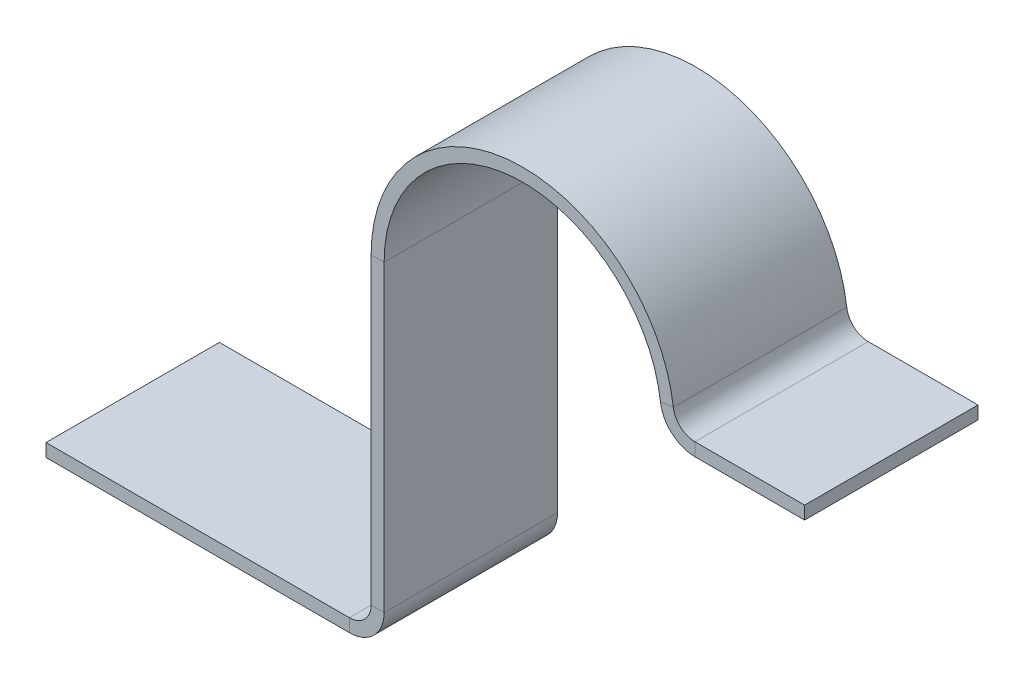
ISO-10303-21;
HEADER;
FILE_DESCRIPTION(('STEP AP214'),'2;1');
FILE_NAME('part.step','',(''),(''),'','','');
FILE_SCHEMA(('AUTOMOTIVE_DESIGN { 1 0 10303 214 1 1 1 1 }'));
ENDSEC;
DATA;
#1=APPLICATION_CONTEXT('core data for automotive mechanical design processes');
#2=APPLICATION_PROTOCOL_DEFINITION('international standard','automotive_design',2000,#1);
#3=PRODUCT_CONTEXT('',#1,'mechanical');
#4=PRODUCT('Part','Part','',(#3));
#5=PRODUCT_RELATED_PRODUCT_CATEGORY('part','',(#4));
#6=PRODUCT_DEFINITION_FORMATION('','',#4);
#7=PRODUCT_DEFINITION_CONTEXT('part definition',#1,'design');
#8=PRODUCT_DEFINITION('design','',#6,#7);
#9=PRODUCT_DEFINITION_SHAPE('','',#8);
#10=(LENGTH_UNIT() NAMED_UNIT(*) SI_UNIT(.MILLI.,.METRE.));
#11=(NAMED_UNIT(*) PLANE_ANGLE_UNIT() SI_UNIT($,.RADIAN.));
#12=(NAMED_UNIT(*) SI_UNIT($,.STERADIAN.) SOLID_ANGLE_UNIT());
#13=UNCERTAINTY_MEASURE_WITH_UNIT(LENGTH_MEASURE(1.E-05),#10,'distance_accuracy_value','');
#14=(GEOMETRIC_REPRESENTATION_CONTEXT(3) GLOBAL_UNCERTAINTY_ASSIGNED_CONTEXT((#13)) GLOBAL_UNIT_ASSIGNED_CONTEXT((#10,
#11,#12)) REPRESENTATION_CONTEXT('',''));
#15=CARTESIAN_POINT('',(0.,0.,0.));
#16=DIRECTION('',(0.,0.,1.));
#17=DIRECTION('',(1.,0.,0.));
#18=AXIS2_PLACEMENT_3D('',#15,#16,#17);
#19=CARTESIAN_POINT('',(3.,75.,40.));
#20=DIRECTION('',(0.,0.,1.));
#21=DIRECTION('',(1.,0.,0.));
#22=AXIS2_PLACEMENT_3D('',#19,#20,#21);
#23=PLANE('',#22);
#24=DIRECTION('',(-1.,0.,0.));
#25=VECTOR('',#24,1.);
#26=CARTESIAN_POINT('',(3.,75.,40.));
#27=LINE('',#26,#25);
#28=CARTESIAN_POINT('',(3.,75.,40.));
#29=VERTEX_POINT('',#28);
#30=CARTESIAN_POINT('',(0.,75.,40.));
#31=VERTEX_POINT('',#30);
#32=EDGE_CURVE('E11',#29,#31,#27,.T.);
#33=ORIENTED_EDGE('',*,*,#32,.F.);
#34=CARTESIAN_POINT('',(35.,75.,40.));
#35=DIRECTION('',(0.,0.,1.));
#36=DIRECTION('',(1.,0.,0.));
#37=AXIS2_PLACEMENT_3D('',#34,#35,#36);
#38=CIRCLE('',#37,32.);
#39=CARTESIAN_POINT('',(66.7490157327751,79.,40.));
#40=VERTEX_POINT('',#39);
#41=EDGE_CURVE('E149',#29,#40,#38,.F.);
#42=ORIENTED_EDGE('',*,*,#41,.T.);
#43=DIRECTION('',(0.992156741649222,0.124999999999999,0.));
#44=VECTOR('',#43,1.);
#45=CARTESIAN_POINT('',(66.7490157327751,79.,40.));
#46=LINE('',#45,#44);
#47=CARTESIAN_POINT('',(69.7254859577228,79.375,40.));
#48=VERTEX_POINT('',#47);
#49=EDGE_CURVE('E254',#40,#48,#46,.T.);
#50=ORIENTED_EDGE('',*,*,#49,.T.);
#51=CARTESIAN_POINT('',(35.,75.,40.));
#52=DIRECTION('',(0.,0.,-1.));
#53=DIRECTION('',(-1.,0.,0.));
#54=AXIS2_PLACEMENT_3D('',#51,#52,#53);
#55=CIRCLE('',#54,35.);
#56=EDGE_CURVE('E152',#31,#48,#55,.T.);
#57=ORIENTED_EDGE('',*,*,#56,.F.);
#58=EDGE_LOOP('',(#33,#42,#50,#57));
#59=FACE_BOUND('',#58,.T.);
#60=ADVANCED_FACE('F38',(#59),#23,.T.);
#61=CARTESIAN_POINT('',(0.,75.,0.));
#62=DIRECTION('',(0.,0.,-1.));
#63=DIRECTION('',(-1.,0.,0.));
#64=AXIS2_PLACEMENT_3D('',#61,#62,#63);
#65=PLANE('',#64);
#66=DIRECTION('',(1.,0.,0.));
#67=VECTOR('',#66,1.);
#68=CARTESIAN_POINT('',(0.,75.,0.));
#69=LINE('',#68,#67);
#70=CARTESIAN_POINT('',(0.,75.,0.));
#71=VERTEX_POINT('',#70);
#72=CARTESIAN_POINT('',(3.,75.,0.));
#73=VERTEX_POINT('',#72);
#74=EDGE_CURVE('E46',#71,#73,#69,.T.);
#75=ORIENTED_EDGE('',*,*,#74,.F.);
#76=CARTESIAN_POINT('',(35.,75.,0.));
#77=DIRECTION('',(0.,0.,-1.));
#78=DIRECTION('',(-1.,0.,0.));
#79=AXIS2_PLACEMENT_3D('',#76,#77,#78);
#80=CIRCLE('',#79,35.);
#81=CARTESIAN_POINT('',(69.7254859577228,79.375,0.));
#82=VERTEX_POINT('',#81);
#83=EDGE_CURVE('E197',#71,#82,#80,.T.);
#84=ORIENTED_EDGE('',*,*,#83,.T.);
#85=DIRECTION('',(-0.992156741649222,-0.124999999999999,0.));
#86=VECTOR('',#85,1.);
#87=CARTESIAN_POINT('',(69.7254859577228,79.375,0.));
#88=LINE('',#87,#86);
#89=CARTESIAN_POINT('',(66.7490157327751,79.,0.));
#90=VERTEX_POINT('',#89);
#91=EDGE_CURVE('E101',#82,#90,#88,.T.);
#92=ORIENTED_EDGE('',*,*,#91,.T.);
#93=CARTESIAN_POINT('',(35.,75.,0.));
#94=DIRECTION('',(0.,0.,1.));
#95=DIRECTION('',(1.,0.,0.));
#96=AXIS2_PLACEMENT_3D('',#93,#94,#95);
#97=CIRCLE('',#96,32.);
#98=EDGE_CURVE('E218',#73,#90,#97,.F.);
#99=ORIENTED_EDGE('',*,*,#98,.F.);
#100=EDGE_LOOP('',(#75,#84,#92,#99));
#101=FACE_BOUND('',#100,.T.);
#102=ADVANCED_FACE('F266',(#101),#65,.T.);
#103=CARTESIAN_POINT('',(0.,5.,40.));
#104=DIRECTION('',(0.,0.,1.));
#105=DIRECTION('',(1.,0.,0.));
#106=AXIS2_PLACEMENT_3D('',#103,#104,#105);
#107=PLANE('',#106);
#108=DIRECTION('',(1.,0.,0.));
#109=VECTOR('',#108,1.);
#110=CARTESIAN_POINT('',(0.,5.,40.));
#111=LINE('',#110,#109);
#112=CARTESIAN_POINT('',(0.,5.,40.));
#113=VERTEX_POINT('',#112);
#114=CARTESIAN_POINT('',(3.,5.,40.));
#115=VERTEX_POINT('',#114);
#116=EDGE_CURVE('E161',#113,#115,#111,.T.);
#117=ORIENTED_EDGE('',*,*,#116,.F.);
#118=CARTESIAN_POINT('',(-5.,5.,40.));
#119=DIRECTION('',(0.,0.,-1.));
#120=DIRECTION('',(-1.,0.,0.));
#121=AXIS2_PLACEMENT_3D('',#118,#119,#120);
#122=CIRCLE('',#121,5.);
#123=CARTESIAN_POINT('',(-5.,0.,40.));
#124=VERTEX_POINT('',#123);
#125=EDGE_CURVE('E306',#124,#113,#122,.F.);
#126=ORIENTED_EDGE('',*,*,#125,.F.);
#127=DIRECTION('',(0.,1.,0.));
#128=VECTOR('',#127,1.);
#129=CARTESIAN_POINT('',(-5.,-3.,40.));
#130=LINE('',#129,#128);
#131=CARTESIAN_POINT('',(-5.,-3.,40.));
#132=VERTEX_POINT('',#131);
#133=EDGE_CURVE('E261',#132,#124,#130,.T.);
#134=ORIENTED_EDGE('',*,*,#133,.F.);
#135=CARTESIAN_POINT('',(-5.,5.,40.));
#136=DIRECTION('',(0.,0.,1.));
#137=DIRECTION('',(1.,0.,0.));
#138=AXIS2_PLACEMENT_3D('',#135,#136,#137);
#139=CIRCLE('',#138,8.);
#140=EDGE_CURVE('E165',#132,#115,#139,.T.);
#141=ORIENTED_EDGE('',*,*,#140,.T.);
#142=EDGE_LOOP('',(#117,#126,#134,#141));
#143=FACE_BOUND('',#142,.T.);
#144=ADVANCED_FACE('F320',(#143),#107,.T.);
#145=CARTESIAN_POINT('',(-5.,-3.,40.));
#146=DIRECTION('',(0.,0.,1.));
#147=DIRECTION('',(1.,0.,0.));
#148=AXIS2_PLACEMENT_3D('',#145,#146,#147);
#149=PLANE('',#148);
#150=DIRECTION('',(0.,1.,0.));
#151=VECTOR('',#150,1.);
#152=CARTESIAN_POINT('',(0.,0.,40.));
#153=LINE('',#152,#151);
#154=EDGE_CURVE('E271',#113,#31,#153,.T.);
#155=ORIENTED_EDGE('',*,*,#154,.F.);
#156=ORIENTED_EDGE('',*,*,#116,.T.);
#157=DIRECTION('',(0.,1.,0.));
#158=VECTOR('',#157,1.);
#159=CARTESIAN_POINT('',(3.,0.,40.));
#160=LINE('',#159,#158);
#161=EDGE_CURVE('E158',#115,#29,#160,.T.);
#162=ORIENTED_EDGE('',*,*,#161,.T.);
#163=ORIENTED_EDGE('',*,*,#32,.T.);
#164=EDGE_LOOP('',(#155,#156,#162,#163));
#165=FACE_BOUND('',#164,.T.);
#166=ADVANCED_FACE('F160',(#165),#149,.T.);
#167=CARTESIAN_POINT('',(-5.,0.,0.));
#168=DIRECTION('',(0.,0.,-1.));
#169=DIRECTION('',(-1.,0.,0.));
#170=AXIS2_PLACEMENT_3D('',#167,#168,#169);
#171=PLANE('',#170);
#172=DIRECTION('',(0.,-1.,0.));
#173=VECTOR('',#172,1.);
#174=CARTESIAN_POINT('',(-5.,0.,0.));
#175=LINE('',#174,#173);
#176=CARTESIAN_POINT('',(-5.,0.,0.));
#177=VERTEX_POINT('',#176);
#178=CARTESIAN_POINT('',(-5.,-3.,0.));
#179=VERTEX_POINT('',#178);
#180=EDGE_CURVE('E259',#177,#179,#175,.T.);
#181=ORIENTED_EDGE('',*,*,#180,.F.);
#182=CARTESIAN_POINT('',(-5.,5.,0.));
#183=DIRECTION('',(0.,0.,-1.));
#184=DIRECTION('',(-1.,0.,0.));
#185=AXIS2_PLACEMENT_3D('',#182,#183,#184);
#186=CIRCLE('',#185,5.);
#187=CARTESIAN_POINT('',(0.,5.,0.));
#188=VERTEX_POINT('',#187);
#189=EDGE_CURVE('E202',#177,#188,#186,.F.);
#190=ORIENTED_EDGE('',*,*,#189,.T.);
#191=DIRECTION('',(-1.,0.,0.));
#192=VECTOR('',#191,1.);
#193=CARTESIAN_POINT('',(3.,5.,0.));
#194=LINE('',#193,#192);
#195=CARTESIAN_POINT('',(3.,5.,0.));
#196=VERTEX_POINT('',#195);
#197=EDGE_CURVE('E257',#196,#188,#194,.T.);
#198=ORIENTED_EDGE('',*,*,#197,.F.);
#199=CARTESIAN_POINT('',(-5.,5.,0.));
#200=DIRECTION('',(0.,0.,1.));
#201=DIRECTION('',(1.,0.,0.));
#202=AXIS2_PLACEMENT_3D('',#199,#200,#201);
#203=CIRCLE('',#202,8.);
#204=EDGE_CURVE('E214',#179,#196,#203,.T.);
#205=ORIENTED_EDGE('',*,*,#204,.F.);
#206=EDGE_LOOP('',(#181,#190,#198,#205));
#207=FACE_BOUND('',#206,.T.);
#208=ADVANCED_FACE('F327',(#207),#171,.T.);
#209=CARTESIAN_POINT('',(3.,5.,0.));
#210=DIRECTION('',(0.,0.,-1.));
#211=DIRECTION('',(-1.,0.,0.));
#212=AXIS2_PLACEMENT_3D('',#209,#210,#211);
#213=PLANE('',#212);
#214=DIRECTION('',(1.,0.,0.));
#215=VECTOR('',#214,1.);
#216=CARTESIAN_POINT('',(-75.,0.,0.));
#217=LINE('',#216,#215);
#218=CARTESIAN_POINT('',(-75.,0.,0.));
#219=VERTEX_POINT('',#218);
#220=EDGE_CURVE('E205',#219,#177,#217,.T.);
#221=ORIENTED_EDGE('',*,*,#220,.T.);
#222=ORIENTED_EDGE('',*,*,#180,.T.);
#223=DIRECTION('',(1.,0.,0.));
#224=VECTOR('',#223,1.);
#225=CARTESIAN_POINT('',(-75.,-3.,0.));
#226=LINE('',#225,#224);
#227=CARTESIAN_POINT('',(-75.,-3.,0.));
#228=VERTEX_POINT('',#227);
#229=EDGE_CURVE('E211',#228,#179,#226,.T.);
#230=ORIENTED_EDGE('',*,*,#229,.F.);
#231=DIRECTION('',(0.,1.,0.));
#232=VECTOR('',#231,1.);
#233=CARTESIAN_POINT('',(-75.,-3.,0.));
#234=LINE('',#233,#232);
#235=EDGE_CURVE('E208',#228,#219,#234,.T.);
#236=ORIENTED_EDGE('',*,*,#235,.T.);
#237=EDGE_LOOP('',(#221,#222,#230,#236));
#238=FACE_BOUND('',#237,.T.);
#239=ADVANCED_FACE('F347',(#238),#213,.T.);
#240=CARTESIAN_POINT('',(74.6862696659689,75.,40.));
#241=DIRECTION('',(0.,0.,1.));
#242=DIRECTION('',(1.,0.,0.));
#243=AXIS2_PLACEMENT_3D('',#240,#241,#242);
#244=PLANE('',#243);
#245=DIRECTION('',(0.,-1.,0.));
#246=VECTOR('',#245,1.);
#247=CARTESIAN_POINT('',(74.6862696659689,75.,40.));
#248=LINE('',#247,#246);
#249=CARTESIAN_POINT('',(74.6862696659689,75.,40.));
#250=VERTEX_POINT('',#249);
#251=CARTESIAN_POINT('',(74.6862696659689,72.,40.));
#252=VERTEX_POINT('',#251);
#253=EDGE_CURVE('E54',#250,#252,#248,.T.);
#254=ORIENTED_EDGE('',*,*,#253,.F.);
#255=CARTESIAN_POINT('',(74.6862696659689,80.,40.));
#256=DIRECTION('',(0.,0.,-1.));
#257=DIRECTION('',(-1.,0.,0.));
#258=AXIS2_PLACEMENT_3D('',#255,#256,#257);
#259=CIRCLE('',#258,5.);
#260=EDGE_CURVE('E299',#48,#250,#259,.F.);
#261=ORIENTED_EDGE('',*,*,#260,.F.);
#262=ORIENTED_EDGE('',*,*,#49,.F.);
#263=CARTESIAN_POINT('',(74.6862696659689,80.,40.));
#264=DIRECTION('',(0.,0.,1.));
#265=DIRECTION('',(1.,0.,0.));
#266=AXIS2_PLACEMENT_3D('',#263,#264,#265);
#267=CIRCLE('',#266,8.);
#268=EDGE_CURVE('E180',#40,#252,#267,.T.);
#269=ORIENTED_EDGE('',*,*,#268,.T.);
#270=EDGE_LOOP('',(#254,#261,#262,#269));
#271=FACE_BOUND('',#270,.T.);
#272=ADVANCED_FACE('F349',(#271),#244,.T.);
#273=CARTESIAN_POINT('',(66.7490157327751,79.,40.));
#274=DIRECTION('',(0.,0.,1.));
#275=DIRECTION('',(1.,0.,0.));
#276=AXIS2_PLACEMENT_3D('',#273,#274,#275);
#277=PLANE('',#276);
#278=DIRECTION('',(1.,0.,0.));
#279=VECTOR('',#278,1.);
#280=CARTESIAN_POINT('',(70.,75.,40.));
#281=LINE('',#280,#279);
#282=CARTESIAN_POINT('',(100.,75.,40.));
#283=VERTEX_POINT('',#282);
#284=EDGE_CURVE('E297',#250,#283,#281,.T.);
#285=ORIENTED_EDGE('',*,*,#284,.F.);
#286=ORIENTED_EDGE('',*,*,#253,.T.);
#287=DIRECTION('',(1.,0.,0.));
#288=VECTOR('',#287,1.);
#289=CARTESIAN_POINT('',(70.,72.,40.));
#290=LINE('',#289,#288);
#291=CARTESIAN_POINT('',(100.,72.,40.));
#292=VERTEX_POINT('',#291);
#293=EDGE_CURVE('E114',#252,#292,#290,.T.);
#294=ORIENTED_EDGE('',*,*,#293,.T.);
#295=DIRECTION('',(0.,-1.,0.));
#296=VECTOR('',#295,1.);
#297=CARTESIAN_POINT('',(100.,75.,40.));
#298=LINE('',#297,#296);
#299=EDGE_CURVE('E295',#283,#292,#298,.T.);
#300=ORIENTED_EDGE('',*,*,#299,.F.);
#301=EDGE_LOOP('',(#285,#286,#294,#300));
#302=FACE_BOUND('',#301,.T.);
#303=ADVANCED_FACE('F355',(#302),#277,.T.);
#304=CARTESIAN_POINT('',(69.7254859577228,79.375,0.));
#305=DIRECTION('',(0.,0.,-1.));
#306=DIRECTION('',(-1.,0.,0.));
#307=AXIS2_PLACEMENT_3D('',#304,#305,#306);
#308=PLANE('',#307);
#309=ORIENTED_EDGE('',*,*,#91,.F.);
#310=CARTESIAN_POINT('',(74.6862696659689,80.,0.));
#311=DIRECTION('',(0.,0.,-1.));
#312=DIRECTION('',(-1.,0.,0.));
#313=AXIS2_PLACEMENT_3D('',#310,#311,#312);
#314=CIRCLE('',#313,5.);
#315=CARTESIAN_POINT('',(74.6862696659689,75.,0.));
#316=VERTEX_POINT('',#315);
#317=EDGE_CURVE('E195',#82,#316,#314,.F.);
#318=ORIENTED_EDGE('',*,*,#317,.T.);
#319=DIRECTION('',(0.,1.,0.));
#320=VECTOR('',#319,1.);
#321=CARTESIAN_POINT('',(74.6862696659689,72.,0.));
#322=LINE('',#321,#320);
#323=CARTESIAN_POINT('',(74.6862696659689,72.,0.));
#324=VERTEX_POINT('',#323);
#325=EDGE_CURVE('E108',#324,#316,#322,.T.);
#326=ORIENTED_EDGE('',*,*,#325,.F.);
#327=CARTESIAN_POINT('',(74.6862696659689,80.,0.));
#328=DIRECTION('',(0.,0.,1.));
#329=DIRECTION('',(1.,0.,0.));
#330=AXIS2_PLACEMENT_3D('',#327,#328,#329);
#331=CIRCLE('',#330,8.);
#332=EDGE_CURVE('E220',#90,#324,#331,.T.);
#333=ORIENTED_EDGE('',*,*,#332,.F.);
#334=EDGE_LOOP('',(#309,#318,#326,#333));
#335=FACE_BOUND('',#334,.T.);
#336=ADVANCED_FACE('F282',(#335),#308,.T.);
#337=CARTESIAN_POINT('',(74.6862696659689,72.,0.));
#338=DIRECTION('',(0.,0.,-1.));
#339=DIRECTION('',(-1.,0.,0.));
#340=AXIS2_PLACEMENT_3D('',#337,#338,#339);
#341=PLANE('',#340);
#342=DIRECTION('',(0.,1.,0.));
#343=VECTOR('',#342,1.);
#344=CARTESIAN_POINT('',(0.,0.,0.));
#345=LINE('',#344,#343);
#346=EDGE_CURVE('E199',#188,#71,#345,.T.);
#347=ORIENTED_EDGE('',*,*,#346,.T.);
#348=ORIENTED_EDGE('',*,*,#74,.T.);
#349=DIRECTION('',(0.,1.,0.));
#350=VECTOR('',#349,1.);
#351=CARTESIAN_POINT('',(3.,0.,0.));
#352=LINE('',#351,#350);
#353=EDGE_CURVE('E172',#196,#73,#352,.T.);
#354=ORIENTED_EDGE('',*,*,#353,.F.);
#355=ORIENTED_EDGE('',*,*,#197,.T.);
#356=EDGE_LOOP('',(#347,#348,#354,#355));
#357=FACE_BOUND('',#356,.T.);
#358=ADVANCED_FACE('F264',(#357),#341,.T.);
#359=CARTESIAN_POINT('',(70.,72.,40.));
#360=DIRECTION('',(0.,1.,0.));
#361=DIRECTION('',(0.,0.,1.));
#362=AXIS2_PLACEMENT_3D('',#359,#360,#361);
#363=PLANE('',#362);
#364=DIRECTION('',(1.,0.,0.));
#365=VECTOR('',#364,1.);
#366=CARTESIAN_POINT('',(70.,72.,0.));
#367=LINE('',#366,#365);
#368=CARTESIAN_POINT('',(100.,72.,0.));
#369=VERTEX_POINT('',#368);
#370=EDGE_CURVE('E186',#324,#369,#367,.T.);
#371=ORIENTED_EDGE('',*,*,#370,.T.);
#372=DIRECTION('',(0.,0.,-1.));
#373=VECTOR('',#372,1.);
#374=CARTESIAN_POINT('',(100.,72.,40.));
#375=LINE('',#374,#373);
#376=EDGE_CURVE('E250',#292,#369,#375,.T.);
#377=ORIENTED_EDGE('',*,*,#376,.F.);
#378=ORIENTED_EDGE('',*,*,#293,.F.);
#379=DIRECTION('',(0.,0.,-1.));
#380=VECTOR('',#379,1.);
#381=CARTESIAN_POINT('',(74.6862696659689,72.,40.));
#382=LINE('',#381,#380);
#383=EDGE_CURVE('E182',#252,#324,#382,.T.);
#384=ORIENTED_EDGE('',*,*,#383,.T.);
#385=EDGE_LOOP('',(#371,#377,#378,#384));
#386=FACE_BOUND('',#385,.T.);
#387=ADVANCED_FACE('F288',(#386),#363,.F.);
#388=CARTESIAN_POINT('',(100.,75.,40.));
#389=DIRECTION('',(1.,0.,0.));
#390=DIRECTION('',(0.,0.,-1.));
#391=AXIS2_PLACEMENT_3D('',#388,#389,#390);
#392=PLANE('',#391);
#393=DIRECTION('',(0.,-1.,0.));
#394=VECTOR('',#393,1.);
#395=CARTESIAN_POINT('',(100.,75.,0.));
#396=LINE('',#395,#394);
#397=CARTESIAN_POINT('',(100.,75.,0.));
#398=VERTEX_POINT('',#397);
#399=EDGE_CURVE('E189',#398,#369,#396,.T.);
#400=ORIENTED_EDGE('',*,*,#399,.F.);
#401=DIRECTION('',(0.,0.,-1.));
#402=VECTOR('',#401,1.);
#403=CARTESIAN_POINT('',(100.,75.,40.));
#404=LINE('',#403,#402);
#405=EDGE_CURVE('E248',#283,#398,#404,.T.);
#406=ORIENTED_EDGE('',*,*,#405,.F.);
#407=ORIENTED_EDGE('',*,*,#299,.T.);
#408=ORIENTED_EDGE('',*,*,#376,.T.);
#409=EDGE_LOOP('',(#400,#406,#407,#408));
#410=FACE_BOUND('',#409,.T.);
#411=ADVANCED_FACE('F293',(#410),#392,.T.);
#412=CARTESIAN_POINT('',(70.,75.,40.));
#413=DIRECTION('',(0.,1.,0.));
#414=DIRECTION('',(0.,0.,1.));
#415=AXIS2_PLACEMENT_3D('',#412,#413,#414);
#416=PLANE('',#415);
#417=DIRECTION('',(1.,0.,0.));
#418=VECTOR('',#417,1.);
#419=CARTESIAN_POINT('',(70.,75.,0.));
#420=LINE('',#419,#418);
#421=EDGE_CURVE('E192',#316,#398,#420,.T.);
#422=ORIENTED_EDGE('',*,*,#421,.F.);
#423=DIRECTION('',(0.,0.,-1.));
#424=VECTOR('',#423,1.);
#425=CARTESIAN_POINT('',(74.6862696659689,75.,40.));
#426=LINE('',#425,#424);
#427=EDGE_CURVE('E245',#250,#316,#426,.T.);
#428=ORIENTED_EDGE('',*,*,#427,.F.);
#429=ORIENTED_EDGE('',*,*,#284,.T.);
#430=ORIENTED_EDGE('',*,*,#405,.T.);
#431=EDGE_LOOP('',(#422,#428,#429,#430));
#432=FACE_BOUND('',#431,.T.);
#433=ADVANCED_FACE('F435',(#432),#416,.T.);
#434=CARTESIAN_POINT('',(74.6862696659689,80.,40.));
#435=DIRECTION('',(0.,0.,-1.));
#436=DIRECTION('',(-1.,0.,0.));
#437=AXIS2_PLACEMENT_3D('',#434,#435,#436);
#438=CYLINDRICAL_SURFACE('',#437,5.);
#439=ORIENTED_EDGE('',*,*,#317,.F.);
#440=DIRECTION('',(0.,0.,-1.));
#441=VECTOR('',#440,1.);
#442=CARTESIAN_POINT('',(69.7254859577228,79.375,40.));
#443=LINE('',#442,#441);
#444=EDGE_CURVE('E242',#48,#82,#443,.T.);
#445=ORIENTED_EDGE('',*,*,#444,.F.);
#446=ORIENTED_EDGE('',*,*,#260,.T.);
#447=ORIENTED_EDGE('',*,*,#427,.T.);
#448=EDGE_LOOP('',(#439,#445,#446,#447));
#449=FACE_BOUND('',#448,.T.);
#450=ADVANCED_FACE('F279',(#449),#438,.F.);
#451=CARTESIAN_POINT('',(35.,75.,40.));
#452=DIRECTION('',(0.,0.,-1.));
#453=DIRECTION('',(-1.,0.,0.));
#454=AXIS2_PLACEMENT_3D('',#451,#452,#453);
#455=CYLINDRICAL_SURFACE('',#454,35.);
#456=ORIENTED_EDGE('',*,*,#83,.F.);
#457=DIRECTION('',(0.,0.,-1.));
#458=VECTOR('',#457,1.);
#459=CARTESIAN_POINT('',(0.,75.,40.));
#460=LINE('',#459,#458);
#461=EDGE_CURVE('E239',#31,#71,#460,.T.);
#462=ORIENTED_EDGE('',*,*,#461,.F.);
#463=ORIENTED_EDGE('',*,*,#56,.T.);
#464=ORIENTED_EDGE('',*,*,#444,.T.);
#465=EDGE_LOOP('',(#456,#462,#463,#464));
#466=FACE_BOUND('',#465,.T.);
#467=ADVANCED_FACE('F273',(#466),#455,.T.);
#468=CARTESIAN_POINT('',(0.,0.,40.));
#469=DIRECTION('',(-1.,0.,0.));
#470=DIRECTION('',(0.,0.,1.));
#471=AXIS2_PLACEMENT_3D('',#468,#469,#470);
#472=PLANE('',#471);
#473=ORIENTED_EDGE('',*,*,#346,.F.);
#474=DIRECTION('',(0.,0.,-1.));
#475=VECTOR('',#474,1.);
#476=CARTESIAN_POINT('',(0.,5.,40.));
#477=LINE('',#476,#475);
#478=EDGE_CURVE('E236',#113,#188,#477,.T.);
#479=ORIENTED_EDGE('',*,*,#478,.F.);
#480=ORIENTED_EDGE('',*,*,#154,.T.);
#481=ORIENTED_EDGE('',*,*,#461,.T.);
#482=EDGE_LOOP('',(#473,#479,#480,#481));
#483=FACE_BOUND('',#482,.T.);
#484=ADVANCED_FACE('F269',(#483),#472,.T.);
#485=CARTESIAN_POINT('',(-5.,5.,40.));
#486=DIRECTION('',(0.,0.,-1.));
#487=DIRECTION('',(-1.,0.,0.));
#488=AXIS2_PLACEMENT_3D('',#485,#486,#487);
#489=CYLINDRICAL_SURFACE('',#488,5.);
#490=ORIENTED_EDGE('',*,*,#189,.F.);
#491=DIRECTION('',(0.,0.,-1.));
#492=VECTOR('',#491,1.);
#493=CARTESIAN_POINT('',(-5.,0.,40.));
#494=LINE('',#493,#492);
#495=EDGE_CURVE('E233',#124,#177,#494,.T.);
#496=ORIENTED_EDGE('',*,*,#495,.F.);
#497=ORIENTED_EDGE('',*,*,#125,.T.);
#498=ORIENTED_EDGE('',*,*,#478,.T.);
#499=EDGE_LOOP('',(#490,#496,#497,#498));
#500=FACE_BOUND('',#499,.T.);
#501=ADVANCED_FACE('F330',(#500),#489,.F.);
#502=CARTESIAN_POINT('',(-75.,0.,40.));
#503=DIRECTION('',(0.,1.,0.));
#504=DIRECTION('',(0.,0.,1.));
#505=AXIS2_PLACEMENT_3D('',#502,#503,#504);
#506=PLANE('',#505);
#507=ORIENTED_EDGE('',*,*,#220,.F.);
#508=DIRECTION('',(0.,0.,-1.));
#509=VECTOR('',#508,1.);
#510=CARTESIAN_POINT('',(-75.,0.,40.));
#511=LINE('',#510,#509);
#512=CARTESIAN_POINT('',(-75.,0.,40.));
#513=VERTEX_POINT('',#512);
#514=EDGE_CURVE('E231',#513,#219,#511,.T.);
#515=ORIENTED_EDGE('',*,*,#514,.F.);
#516=DIRECTION('',(1.,0.,0.));
#517=VECTOR('',#516,1.);
#518=CARTESIAN_POINT('',(-75.,0.,40.));
#519=LINE('',#518,#517);
#520=EDGE_CURVE('E309',#513,#124,#519,.T.);
#521=ORIENTED_EDGE('',*,*,#520,.T.);
#522=ORIENTED_EDGE('',*,*,#495,.T.);
#523=EDGE_LOOP('',(#507,#515,#521,#522));
#524=FACE_BOUND('',#523,.T.);
#525=ADVANCED_FACE('F335',(#524),#506,.T.);
#526=CARTESIAN_POINT('',(-75.,-3.,40.));
#527=DIRECTION('',(-1.,0.,0.));
#528=DIRECTION('',(0.,0.,1.));
#529=AXIS2_PLACEMENT_3D('',#526,#527,#528);
#530=PLANE('',#529);
#531=ORIENTED_EDGE('',*,*,#235,.F.);
#532=DIRECTION('',(0.,0.,-1.));
#533=VECTOR('',#532,1.);
#534=CARTESIAN_POINT('',(-75.,-3.,40.));
#535=LINE('',#534,#533);
#536=CARTESIAN_POINT('',(-75.,-3.,40.));
#537=VERTEX_POINT('',#536);
#538=EDGE_CURVE('E229',#537,#228,#535,.T.);
#539=ORIENTED_EDGE('',*,*,#538,.F.);
#540=DIRECTION('',(0.,1.,0.));
#541=VECTOR('',#540,1.);
#542=CARTESIAN_POINT('',(-75.,-3.,40.));
#543=LINE('',#542,#541);
#544=EDGE_CURVE('E312',#537,#513,#543,.T.);
#545=ORIENTED_EDGE('',*,*,#544,.T.);
#546=ORIENTED_EDGE('',*,*,#514,.T.);
#547=EDGE_LOOP('',(#531,#539,#545,#546));
#548=FACE_BOUND('',#547,.T.);
#549=ADVANCED_FACE('F341',(#548),#530,.T.);
#550=CARTESIAN_POINT('',(-75.,-3.,40.));
#551=DIRECTION('',(0.,1.,0.));
#552=DIRECTION('',(0.,0.,1.));
#553=AXIS2_PLACEMENT_3D('',#550,#551,#552);
#554=PLANE('',#553);
#555=ORIENTED_EDGE('',*,*,#229,.T.);
#556=DIRECTION('',(0.,0.,-1.));
#557=VECTOR('',#556,1.);
#558=CARTESIAN_POINT('',(-5.,-3.,40.));
#559=LINE('',#558,#557);
#560=EDGE_CURVE('E226',#132,#179,#559,.T.);
#561=ORIENTED_EDGE('',*,*,#560,.F.);
#562=DIRECTION('',(1.,0.,0.));
#563=VECTOR('',#562,1.);
#564=CARTESIAN_POINT('',(-75.,-3.,40.));
#565=LINE('',#564,#563);
#566=EDGE_CURVE('E315',#537,#132,#565,.T.);
#567=ORIENTED_EDGE('',*,*,#566,.F.);
#568=ORIENTED_EDGE('',*,*,#538,.T.);
#569=EDGE_LOOP('',(#555,#561,#567,#568));
#570=FACE_BOUND('',#569,.T.);
#571=ADVANCED_FACE('F345',(#570),#554,.F.);
#572=CARTESIAN_POINT('',(-5.,5.,40.));
#573=DIRECTION('',(0.,0.,-1.));
#574=DIRECTION('',(-1.,0.,0.));
#575=AXIS2_PLACEMENT_3D('',#572,#573,#574);
#576=CYLINDRICAL_SURFACE('',#575,8.);
#577=ORIENTED_EDGE('',*,*,#204,.T.);
#578=DIRECTION('',(0.,0.,-1.));
#579=VECTOR('',#578,1.);
#580=CARTESIAN_POINT('',(3.,5.,40.));
#581=LINE('',#580,#579);
#582=EDGE_CURVE('E174',#115,#196,#581,.T.);
#583=ORIENTED_EDGE('',*,*,#582,.F.);
#584=ORIENTED_EDGE('',*,*,#140,.F.);
#585=ORIENTED_EDGE('',*,*,#560,.T.);
#586=EDGE_LOOP('',(#577,#583,#584,#585));
#587=FACE_BOUND('',#586,.T.);
#588=ADVANCED_FACE('F323',(#587),#576,.T.);
#589=CARTESIAN_POINT('',(3.,0.,40.));
#590=DIRECTION('',(-1.,0.,0.));
#591=DIRECTION('',(0.,0.,1.));
#592=AXIS2_PLACEMENT_3D('',#589,#590,#591);
#593=PLANE('',#592);
#594=ORIENTED_EDGE('',*,*,#353,.T.);
#595=DIRECTION('',(0.,0.,-1.));
#596=VECTOR('',#595,1.);
#597=CARTESIAN_POINT('',(3.,75.,40.));
#598=LINE('',#597,#596);
#599=EDGE_CURVE('E169',#29,#73,#598,.T.);
#600=ORIENTED_EDGE('',*,*,#599,.F.);
#601=ORIENTED_EDGE('',*,*,#161,.F.);
#602=ORIENTED_EDGE('',*,*,#582,.T.);
#603=EDGE_LOOP('',(#594,#600,#601,#602));
#604=FACE_BOUND('',#603,.T.);
#605=ADVANCED_FACE('F170',(#604),#593,.F.);
#606=CARTESIAN_POINT('',(35.,75.,40.));
#607=DIRECTION('',(0.,0.,-1.));
#608=DIRECTION('',(-1.,0.,0.));
#609=AXIS2_PLACEMENT_3D('',#606,#607,#608);
#610=CYLINDRICAL_SURFACE('',#609,32.);
#611=ORIENTED_EDGE('',*,*,#98,.T.);
#612=DIRECTION('',(0.,0.,-1.));
#613=VECTOR('',#612,1.);
#614=CARTESIAN_POINT('',(66.7490157327751,79.,40.));
#615=LINE('',#614,#613);
#616=EDGE_CURVE('E175',#40,#90,#615,.T.);
#617=ORIENTED_EDGE('',*,*,#616,.F.);
#618=ORIENTED_EDGE('',*,*,#41,.F.);
#619=ORIENTED_EDGE('',*,*,#599,.T.);
#620=EDGE_LOOP('',(#611,#617,#618,#619));
#621=FACE_BOUND('',#620,.T.);
#622=ADVANCED_FACE('F177',(#621),#610,.F.);
#623=CARTESIAN_POINT('',(74.6862696659689,80.,40.));
#624=DIRECTION('',(0.,0.,-1.));
#625=DIRECTION('',(-1.,0.,0.));
#626=AXIS2_PLACEMENT_3D('',#623,#624,#625);
#627=CYLINDRICAL_SURFACE('',#626,8.);
#628=ORIENTED_EDGE('',*,*,#332,.T.);
#629=ORIENTED_EDGE('',*,*,#383,.F.);
#630=ORIENTED_EDGE('',*,*,#268,.F.);
#631=ORIENTED_EDGE('',*,*,#616,.T.);
#632=EDGE_LOOP('',(#628,#629,#630,#631));
#633=FACE_BOUND('',#632,.T.);
#634=ADVANCED_FACE('F285',(#633),#627,.T.);
#635=CARTESIAN_POINT('',(74.6862696659689,80.,40.));
#636=DIRECTION('',(0.,0.,-1.));
#637=DIRECTION('',(-1.,0.,0.));
#638=AXIS2_PLACEMENT_3D('',#635,#636,#637);
#639=PLANE('',#638);
#640=ORIENTED_EDGE('',*,*,#566,.T.);
#641=ORIENTED_EDGE('',*,*,#133,.T.);
#642=ORIENTED_EDGE('',*,*,#520,.F.);
#643=ORIENTED_EDGE('',*,*,#544,.F.);
#644=EDGE_LOOP('',(#640,#641,#642,#643));
#645=FACE_BOUND('',#644,.T.);
#646=ADVANCED_FACE('F338',(#645),#639,.F.);
#647=CARTESIAN_POINT('',(74.6862696659689,80.,0.));
#648=DIRECTION('',(0.,0.,-1.));
#649=DIRECTION('',(-1.,0.,0.));
#650=AXIS2_PLACEMENT_3D('',#647,#648,#649);
#651=PLANE('',#650);
#652=ORIENTED_EDGE('',*,*,#370,.F.);
#653=ORIENTED_EDGE('',*,*,#325,.T.);
#654=ORIENTED_EDGE('',*,*,#421,.T.);
#655=ORIENTED_EDGE('',*,*,#399,.T.);
#656=EDGE_LOOP('',(#652,#653,#654,#655));
#657=FACE_BOUND('',#656,.T.);
#658=ADVANCED_FACE('F290',(#657),#651,.T.);
#659=CLOSED_SHELL('',(#60,#102,#144,#166,#208,#239,#272,#303,#336,#358,#387,#411,#433,#450,#467,
#484,#501,#525,#549,#571,#588,#605,#622,#634,#646,#658));
#660=MANIFOLD_SOLID_BREP('B2',#659);
#661=ADVANCED_BREP_SHAPE_REPRESENTATION('',(#18,#660),#14);
#662=SHAPE_DEFINITION_REPRESENTATION(#9,#661);
ENDSEC;
END-ISO-10303-21;
